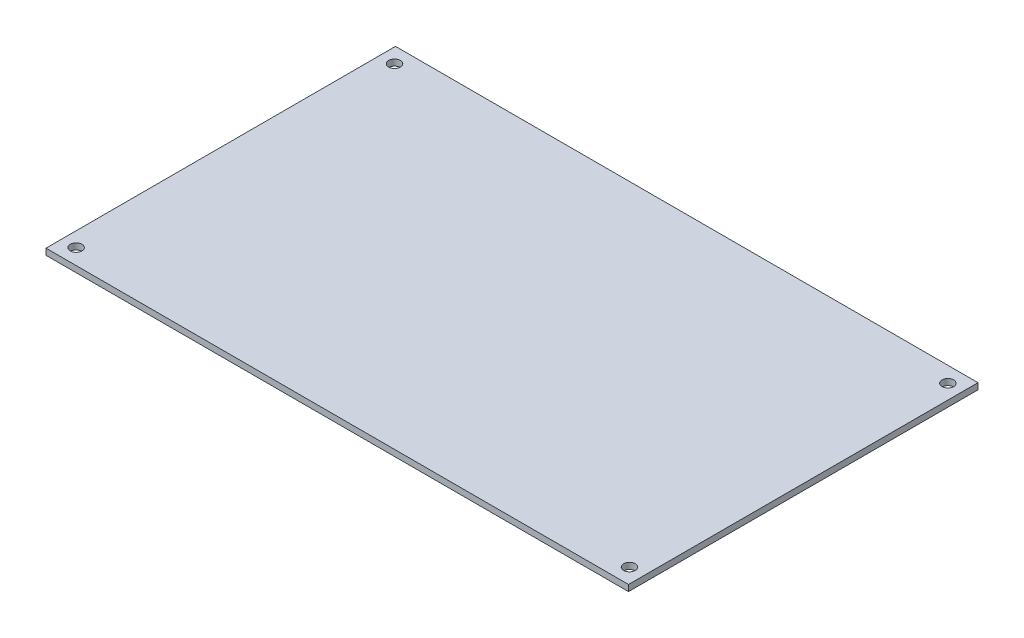
ISO-10303-21;
HEADER;
FILE_DESCRIPTION(('STEP AP214'),'2;1');
FILE_NAME('part.step','',(''),(''),'','','');
FILE_SCHEMA(('AUTOMOTIVE_DESIGN { 1 0 10303 214 1 1 1 1 }'));
ENDSEC;
DATA;
#1=APPLICATION_CONTEXT('core data for automotive mechanical design processes');
#2=APPLICATION_PROTOCOL_DEFINITION('international standard','automotive_design',2000,#1);
#3=PRODUCT_CONTEXT('',#1,'mechanical');
#4=PRODUCT('Part','Part','',(#3));
#5=PRODUCT_RELATED_PRODUCT_CATEGORY('part','',(#4));
#6=PRODUCT_DEFINITION_FORMATION('','',#4);
#7=PRODUCT_DEFINITION_CONTEXT('part definition',#1,'design');
#8=PRODUCT_DEFINITION('design','',#6,#7);
#9=PRODUCT_DEFINITION_SHAPE('','',#8);
#10=(LENGTH_UNIT() NAMED_UNIT(*) SI_UNIT(.MILLI.,.METRE.));
#11=(NAMED_UNIT(*) PLANE_ANGLE_UNIT() SI_UNIT($,.RADIAN.));
#12=(NAMED_UNIT(*) SI_UNIT($,.STERADIAN.) SOLID_ANGLE_UNIT());
#13=UNCERTAINTY_MEASURE_WITH_UNIT(LENGTH_MEASURE(1.E-05),#10,'distance_accuracy_value','');
#14=(GEOMETRIC_REPRESENTATION_CONTEXT(3) GLOBAL_UNCERTAINTY_ASSIGNED_CONTEXT((#13)) GLOBAL_UNIT_ASSIGNED_CONTEXT((#10,
#11,#12)) REPRESENTATION_CONTEXT('',''));
#15=CARTESIAN_POINT('',(0.,0.,0.));
#16=DIRECTION('',(0.,0.,1.));
#17=DIRECTION('',(1.,0.,0.));
#18=AXIS2_PLACEMENT_3D('',#15,#16,#17);
#19=CARTESIAN_POINT('',(-75.,1.6,45.));
#20=DIRECTION('',(1.,0.,0.));
#21=DIRECTION('',(0.,0.,-1.));
#22=AXIS2_PLACEMENT_3D('',#19,#20,#21);
#23=PLANE('',#22);
#24=DIRECTION('',(0.,0.,1.));
#25=VECTOR('',#24,1.);
#26=CARTESIAN_POINT('',(-75.,0.,45.));
#27=LINE('',#26,#25);
#28=CARTESIAN_POINT('',(-75.,0.,-45.));
#29=VERTEX_POINT('',#28);
#30=CARTESIAN_POINT('',(-75.,0.,45.));
#31=VERTEX_POINT('',#30);
#32=EDGE_CURVE('E102',#29,#31,#27,.T.);
#33=ORIENTED_EDGE('',*,*,#32,.T.);
#34=DIRECTION('',(0.,-1.,0.));
#35=VECTOR('',#34,1.);
#36=CARTESIAN_POINT('',(-75.,1.6,45.));
#37=LINE('',#36,#35);
#38=CARTESIAN_POINT('',(-75.,1.6,45.));
#39=VERTEX_POINT('',#38);
#40=EDGE_CURVE('E11',#39,#31,#37,.T.);
#41=ORIENTED_EDGE('',*,*,#40,.F.);
#42=DIRECTION('',(0.,0.,1.));
#43=VECTOR('',#42,1.);
#44=CARTESIAN_POINT('',(-75.,1.6,45.));
#45=LINE('',#44,#43);
#46=CARTESIAN_POINT('',(-75.,1.6,-45.));
#47=VERTEX_POINT('',#46);
#48=EDGE_CURVE('E90',#47,#39,#45,.T.);
#49=ORIENTED_EDGE('',*,*,#48,.F.);
#50=DIRECTION('',(0.,-1.,0.));
#51=VECTOR('',#50,1.);
#52=CARTESIAN_POINT('',(-75.,1.6,-45.));
#53=LINE('',#52,#51);
#54=EDGE_CURVE('E98',#47,#29,#53,.T.);
#55=ORIENTED_EDGE('',*,*,#54,.T.);
#56=EDGE_LOOP('',(#33,#41,#49,#55));
#57=FACE_BOUND('',#56,.T.);
#58=ADVANCED_FACE('F39',(#57),#23,.F.);
#59=CARTESIAN_POINT('',(75.,1.6,45.));
#60=DIRECTION('',(0.,0.,-1.));
#61=DIRECTION('',(-1.,0.,0.));
#62=AXIS2_PLACEMENT_3D('',#59,#60,#61);
#63=PLANE('',#62);
#64=DIRECTION('',(1.,0.,0.));
#65=VECTOR('',#64,1.);
#66=CARTESIAN_POINT('',(75.,0.,45.));
#67=LINE('',#66,#65);
#68=CARTESIAN_POINT('',(75.,0.,45.));
#69=VERTEX_POINT('',#68);
#70=EDGE_CURVE('E94',#31,#69,#67,.T.);
#71=ORIENTED_EDGE('',*,*,#70,.T.);
#72=DIRECTION('',(0.,-1.,0.));
#73=VECTOR('',#72,1.);
#74=CARTESIAN_POINT('',(75.,1.6,45.));
#75=LINE('',#74,#73);
#76=CARTESIAN_POINT('',(75.,1.6,45.));
#77=VERTEX_POINT('',#76);
#78=EDGE_CURVE('E47',#77,#69,#75,.T.);
#79=ORIENTED_EDGE('',*,*,#78,.F.);
#80=DIRECTION('',(1.,0.,0.));
#81=VECTOR('',#80,1.);
#82=CARTESIAN_POINT('',(75.,1.6,45.));
#83=LINE('',#82,#81);
#84=EDGE_CURVE('E85',#39,#77,#83,.T.);
#85=ORIENTED_EDGE('',*,*,#84,.F.);
#86=ORIENTED_EDGE('',*,*,#40,.T.);
#87=EDGE_LOOP('',(#71,#79,#85,#86));
#88=FACE_BOUND('',#87,.T.);
#89=ADVANCED_FACE('F93',(#88),#63,.F.);
#90=CARTESIAN_POINT('',(75.,1.6,45.));
#91=DIRECTION('',(-1.,0.,0.));
#92=DIRECTION('',(0.,0.,1.));
#93=AXIS2_PLACEMENT_3D('',#90,#91,#92);
#94=PLANE('',#93);
#95=DIRECTION('',(0.,0.,-1.));
#96=VECTOR('',#95,1.);
#97=CARTESIAN_POINT('',(75.,0.,45.));
#98=LINE('',#97,#96);
#99=CARTESIAN_POINT('',(75.,0.,-45.));
#100=VERTEX_POINT('',#99);
#101=EDGE_CURVE('E72',#69,#100,#98,.T.);
#102=ORIENTED_EDGE('',*,*,#101,.T.);
#103=DIRECTION('',(0.,-1.,0.));
#104=VECTOR('',#103,1.);
#105=CARTESIAN_POINT('',(75.,1.6,-45.));
#106=LINE('',#105,#104);
#107=CARTESIAN_POINT('',(75.,1.6,-45.));
#108=VERTEX_POINT('',#107);
#109=EDGE_CURVE('E95',#108,#100,#106,.T.);
#110=ORIENTED_EDGE('',*,*,#109,.F.);
#111=DIRECTION('',(0.,0.,-1.));
#112=VECTOR('',#111,1.);
#113=CARTESIAN_POINT('',(75.,1.6,45.));
#114=LINE('',#113,#112);
#115=EDGE_CURVE('E88',#77,#108,#114,.T.);
#116=ORIENTED_EDGE('',*,*,#115,.F.);
#117=ORIENTED_EDGE('',*,*,#78,.T.);
#118=EDGE_LOOP('',(#102,#110,#116,#117));
#119=FACE_BOUND('',#118,.T.);
#120=ADVANCED_FACE('F96',(#119),#94,.F.);
#121=CARTESIAN_POINT('',(75.,1.6,-45.));
#122=DIRECTION('',(0.,0.,1.));
#123=DIRECTION('',(1.,0.,0.));
#124=AXIS2_PLACEMENT_3D('',#121,#122,#123);
#125=PLANE('',#124);
#126=DIRECTION('',(-1.,0.,0.));
#127=VECTOR('',#126,1.);
#128=CARTESIAN_POINT('',(75.,0.,-45.));
#129=LINE('',#128,#127);
#130=EDGE_CURVE('E78',#100,#29,#129,.T.);
#131=ORIENTED_EDGE('',*,*,#130,.T.);
#132=ORIENTED_EDGE('',*,*,#54,.F.);
#133=DIRECTION('',(-1.,0.,0.));
#134=VECTOR('',#133,1.);
#135=CARTESIAN_POINT('',(75.,1.6,-45.));
#136=LINE('',#135,#134);
#137=EDGE_CURVE('E55',#108,#47,#136,.T.);
#138=ORIENTED_EDGE('',*,*,#137,.F.);
#139=ORIENTED_EDGE('',*,*,#109,.T.);
#140=EDGE_LOOP('',(#131,#132,#138,#139));
#141=FACE_BOUND('',#140,.T.);
#142=ADVANCED_FACE('F110',(#141),#125,.F.);
#143=CARTESIAN_POINT('',(0.,1.6,0.));
#144=DIRECTION('',(0.,1.,0.));
#145=DIRECTION('',(0.,0.,1.));
#146=AXIS2_PLACEMENT_3D('',#143,#144,#145);
#147=PLANE('',#146);
#148=CARTESIAN_POINT('',(71.25,1.6,-41.));
#149=DIRECTION('',(0.,1.,0.));
#150=DIRECTION('',(0.,0.,1.));
#151=AXIS2_PLACEMENT_3D('',#148,#149,#150);
#152=CIRCLE('',#151,1.5);
#153=CARTESIAN_POINT('',(71.25,1.6,-39.5));
#154=VERTEX_POINT('',#153);
#155=EDGE_CURVE('E125',#154,#154,#152,.T.);
#156=ORIENTED_EDGE('',*,*,#155,.F.);
#157=EDGE_LOOP('',(#156));
#158=FACE_BOUND('',#157,.T.);
#159=CARTESIAN_POINT('',(71.25,1.6,41.));
#160=DIRECTION('',(0.,1.,0.));
#161=DIRECTION('',(0.,0.,1.));
#162=AXIS2_PLACEMENT_3D('',#159,#160,#161);
#163=CIRCLE('',#162,1.5);
#164=CARTESIAN_POINT('',(71.25,1.6,42.5));
#165=VERTEX_POINT('',#164);
#166=EDGE_CURVE('E131',#165,#165,#163,.T.);
#167=ORIENTED_EDGE('',*,*,#166,.F.);
#168=EDGE_LOOP('',(#167));
#169=FACE_BOUND('',#168,.T.);
#170=CARTESIAN_POINT('',(-71.25,1.6,41.));
#171=DIRECTION('',(0.,1.,0.));
#172=DIRECTION('',(0.,0.,1.));
#173=AXIS2_PLACEMENT_3D('',#170,#171,#172);
#174=CIRCLE('',#173,1.5);
#175=CARTESIAN_POINT('',(-71.25,1.6,42.5));
#176=VERTEX_POINT('',#175);
#177=EDGE_CURVE('E119',#176,#176,#174,.T.);
#178=ORIENTED_EDGE('',*,*,#177,.F.);
#179=EDGE_LOOP('',(#178));
#180=FACE_BOUND('',#179,.T.);
#181=CARTESIAN_POINT('',(-71.25,1.6,-41.));
#182=DIRECTION('',(0.,1.,0.));
#183=DIRECTION('',(0.,0.,1.));
#184=AXIS2_PLACEMENT_3D('',#181,#182,#183);
#185=CIRCLE('',#184,1.5);
#186=CARTESIAN_POINT('',(-71.25,1.6,-39.5));
#187=VERTEX_POINT('',#186);
#188=EDGE_CURVE('E116',#187,#187,#185,.T.);
#189=ORIENTED_EDGE('',*,*,#188,.F.);
#190=EDGE_LOOP('',(#189));
#191=FACE_BOUND('',#190,.T.);
#192=ORIENTED_EDGE('',*,*,#48,.T.);
#193=ORIENTED_EDGE('',*,*,#84,.T.);
#194=ORIENTED_EDGE('',*,*,#115,.T.);
#195=ORIENTED_EDGE('',*,*,#137,.T.);
#196=EDGE_LOOP('',(#192,#193,#194,#195));
#197=FACE_BOUND('',#196,.T.);
#198=ADVANCED_FACE('F86',(#158,#169,#180,#191,#197),#147,.T.);
#199=CARTESIAN_POINT('',(0.,0.,0.));
#200=DIRECTION('',(0.,1.,0.));
#201=DIRECTION('',(0.,0.,1.));
#202=AXIS2_PLACEMENT_3D('',#199,#200,#201);
#203=PLANE('',#202);
#204=CARTESIAN_POINT('',(71.25,0.,-41.));
#205=DIRECTION('',(0.,1.,0.));
#206=DIRECTION('',(0.,0.,1.));
#207=AXIS2_PLACEMENT_3D('',#204,#205,#206);
#208=CIRCLE('',#207,1.5);
#209=CARTESIAN_POINT('',(71.25,0.,-39.5));
#210=VERTEX_POINT('',#209);
#211=EDGE_CURVE('E122',#210,#210,#208,.T.);
#212=ORIENTED_EDGE('',*,*,#211,.T.);
#213=EDGE_LOOP('',(#212));
#214=FACE_BOUND('',#213,.T.);
#215=CARTESIAN_POINT('',(71.25,0.,41.));
#216=DIRECTION('',(0.,1.,0.));
#217=DIRECTION('',(0.,0.,1.));
#218=AXIS2_PLACEMENT_3D('',#215,#216,#217);
#219=CIRCLE('',#218,1.5);
#220=CARTESIAN_POINT('',(71.25,0.,42.5));
#221=VERTEX_POINT('',#220);
#222=EDGE_CURVE('E128',#221,#221,#219,.T.);
#223=ORIENTED_EDGE('',*,*,#222,.T.);
#224=EDGE_LOOP('',(#223));
#225=FACE_BOUND('',#224,.T.);
#226=CARTESIAN_POINT('',(-71.25,0.,41.));
#227=DIRECTION('',(0.,1.,0.));
#228=DIRECTION('',(0.,0.,1.));
#229=AXIS2_PLACEMENT_3D('',#226,#227,#228);
#230=CIRCLE('',#229,1.5);
#231=CARTESIAN_POINT('',(-71.25,0.,42.5));
#232=VERTEX_POINT('',#231);
#233=EDGE_CURVE('E134',#232,#232,#230,.T.);
#234=ORIENTED_EDGE('',*,*,#233,.T.);
#235=EDGE_LOOP('',(#234));
#236=FACE_BOUND('',#235,.T.);
#237=CARTESIAN_POINT('',(-71.25,0.,-41.));
#238=DIRECTION('',(0.,1.,0.));
#239=DIRECTION('',(0.,0.,1.));
#240=AXIS2_PLACEMENT_3D('',#237,#238,#239);
#241=CIRCLE('',#240,1.5);
#242=CARTESIAN_POINT('',(-71.25,0.,-39.5));
#243=VERTEX_POINT('',#242);
#244=EDGE_CURVE('E105',#243,#243,#241,.T.);
#245=ORIENTED_EDGE('',*,*,#244,.T.);
#246=EDGE_LOOP('',(#245));
#247=FACE_BOUND('',#246,.T.);
#248=ORIENTED_EDGE('',*,*,#32,.F.);
#249=ORIENTED_EDGE('',*,*,#130,.F.);
#250=ORIENTED_EDGE('',*,*,#101,.F.);
#251=ORIENTED_EDGE('',*,*,#70,.F.);
#252=EDGE_LOOP('',(#248,#249,#250,#251));
#253=FACE_BOUND('',#252,.T.);
#254=ADVANCED_FACE('F113',(#214,#225,#236,#247,#253),#203,.F.);
#255=CARTESIAN_POINT('',(-71.25,0.,-41.));
#256=DIRECTION('',(0.,1.,0.));
#257=DIRECTION('',(0.,0.,1.));
#258=AXIS2_PLACEMENT_3D('',#255,#256,#257);
#259=CYLINDRICAL_SURFACE('',#258,1.5);
#260=ORIENTED_EDGE('',*,*,#244,.F.);
#261=EDGE_LOOP('',(#260));
#262=FACE_BOUND('',#261,.T.);
#263=ORIENTED_EDGE('',*,*,#188,.T.);
#264=EDGE_LOOP('',(#263));
#265=FACE_BOUND('',#264,.T.);
#266=ADVANCED_FACE('F148',(#262,#265),#259,.F.);
#267=CARTESIAN_POINT('',(-71.25,0.,41.));
#268=DIRECTION('',(0.,1.,0.));
#269=DIRECTION('',(0.,0.,1.));
#270=AXIS2_PLACEMENT_3D('',#267,#268,#269);
#271=CYLINDRICAL_SURFACE('',#270,1.5);
#272=ORIENTED_EDGE('',*,*,#233,.F.);
#273=EDGE_LOOP('',(#272));
#274=FACE_BOUND('',#273,.T.);
#275=ORIENTED_EDGE('',*,*,#177,.T.);
#276=EDGE_LOOP('',(#275));
#277=FACE_BOUND('',#276,.T.);
#278=ADVANCED_FACE('F140',(#274,#277),#271,.F.);
#279=CARTESIAN_POINT('',(71.25,0.,41.));
#280=DIRECTION('',(0.,1.,0.));
#281=DIRECTION('',(0.,0.,1.));
#282=AXIS2_PLACEMENT_3D('',#279,#280,#281);
#283=CYLINDRICAL_SURFACE('',#282,1.5);
#284=ORIENTED_EDGE('',*,*,#222,.F.);
#285=EDGE_LOOP('',(#284));
#286=FACE_BOUND('',#285,.T.);
#287=ORIENTED_EDGE('',*,*,#166,.T.);
#288=EDGE_LOOP('',(#287));
#289=FACE_BOUND('',#288,.T.);
#290=ADVANCED_FACE('F156',(#286,#289),#283,.F.);
#291=CARTESIAN_POINT('',(71.25,0.,-41.));
#292=DIRECTION('',(0.,1.,0.));
#293=DIRECTION('',(0.,0.,1.));
#294=AXIS2_PLACEMENT_3D('',#291,#292,#293);
#295=CYLINDRICAL_SURFACE('',#294,1.5);
#296=ORIENTED_EDGE('',*,*,#211,.F.);
#297=EDGE_LOOP('',(#296));
#298=FACE_BOUND('',#297,.T.);
#299=ORIENTED_EDGE('',*,*,#155,.T.);
#300=EDGE_LOOP('',(#299));
#301=FACE_BOUND('',#300,.T.);
#302=ADVANCED_FACE('F207',(#298,#301),#295,.F.);
#303=CLOSED_SHELL('',(#58,#89,#120,#142,#198,#254,#266,#278,#290,#302));
#304=MANIFOLD_SOLID_BREP('B2',#303);
#305=ADVANCED_BREP_SHAPE_REPRESENTATION('',(#18,#304),#14);
#306=SHAPE_DEFINITION_REPRESENTATION(#9,#305);
ENDSEC;
END-ISO-10303-21;
